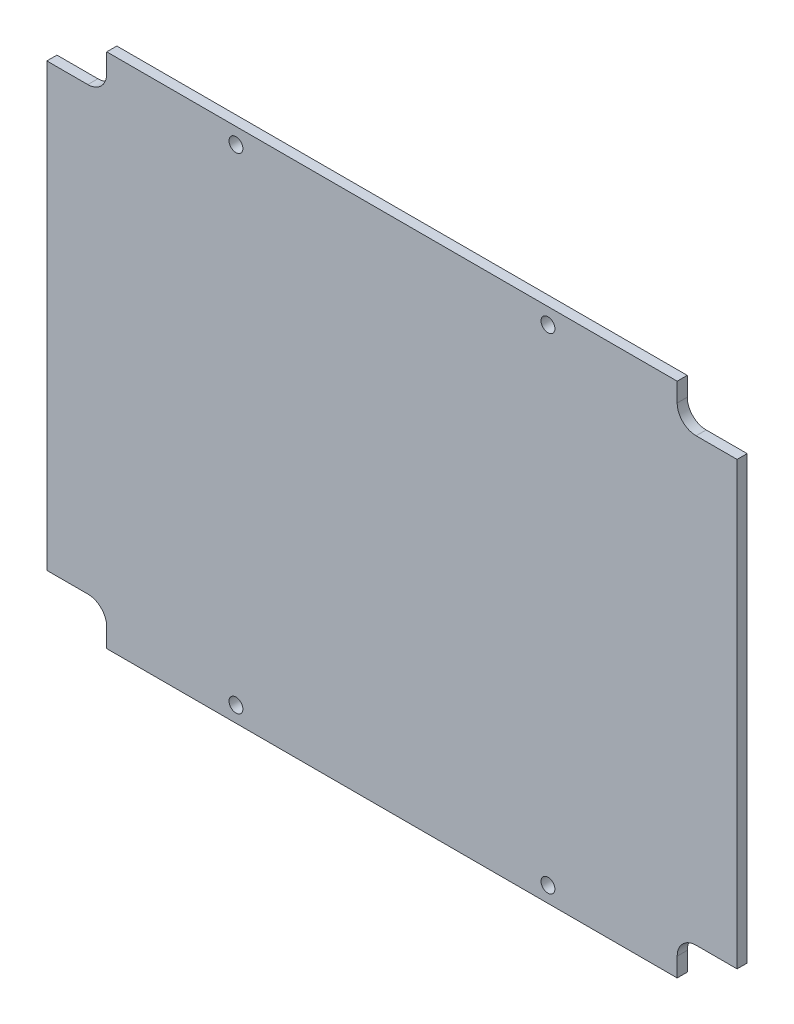
ISO-10303-21;
HEADER;
FILE_DESCRIPTION(('STEP AP214'),'2;1');
FILE_NAME('part.step','',(''),(''),'','','');
FILE_SCHEMA(('AUTOMOTIVE_DESIGN { 1 0 10303 214 1 1 1 1 }'));
ENDSEC;
DATA;
#1=APPLICATION_CONTEXT('core data for automotive mechanical design processes');
#2=APPLICATION_PROTOCOL_DEFINITION('international standard','automotive_design',2000,#1);
#3=PRODUCT_CONTEXT('',#1,'mechanical');
#4=PRODUCT('Part','Part','',(#3));
#5=PRODUCT_RELATED_PRODUCT_CATEGORY('part','',(#4));
#6=PRODUCT_DEFINITION_FORMATION('','',#4);
#7=PRODUCT_DEFINITION_CONTEXT('part definition',#1,'design');
#8=PRODUCT_DEFINITION('design','',#6,#7);
#9=PRODUCT_DEFINITION_SHAPE('','',#8);
#10=(LENGTH_UNIT() NAMED_UNIT(*) SI_UNIT(.MILLI.,.METRE.));
#11=(NAMED_UNIT(*) PLANE_ANGLE_UNIT() SI_UNIT($,.RADIAN.));
#12=(NAMED_UNIT(*) SI_UNIT($,.STERADIAN.) SOLID_ANGLE_UNIT());
#13=UNCERTAINTY_MEASURE_WITH_UNIT(LENGTH_MEASURE(1.E-05),#10,'distance_accuracy_value','');
#14=(GEOMETRIC_REPRESENTATION_CONTEXT(3) GLOBAL_UNCERTAINTY_ASSIGNED_CONTEXT((#13)) GLOBAL_UNIT_ASSIGNED_CONTEXT((#10,
#11,#12)) REPRESENTATION_CONTEXT('',''));
#15=CARTESIAN_POINT('',(0.,0.,0.));
#16=DIRECTION('',(0.,0.,1.));
#17=DIRECTION('',(1.,0.,0.));
#18=AXIS2_PLACEMENT_3D('',#15,#16,#17);
#19=CARTESIAN_POINT('',(-55.493641501856,9.95185693007489,1.6));
#20=DIRECTION('',(0.,0.,1.));
#21=DIRECTION('',(1.,0.,0.));
#22=AXIS2_PLACEMENT_3D('',#19,#20,#21);
#23=PLANE('',#22);
#24=CARTESIAN_POINT('',(24.006358498144,6.45185693007488,1.6));
#25=DIRECTION('',(0.,0.,1.));
#26=DIRECTION('',(1.,0.,0.));
#27=AXIS2_PLACEMENT_3D('',#24,#25,#26);
#28=CIRCLE('',#27,1.1);
#29=CARTESIAN_POINT('',(25.106358498144,6.45185693007488,1.6));
#30=VERTEX_POINT('',#29);
#31=EDGE_CURVE('E518',#30,#30,#28,.T.);
#32=ORIENTED_EDGE('',*,*,#31,.F.);
#33=EDGE_LOOP('',(#32));
#34=FACE_BOUND('',#33,.T.);
#35=CARTESIAN_POINT('',(-25.493641501856,83.4518569300749,1.6));
#36=DIRECTION('',(0.,0.,1.));
#37=DIRECTION('',(1.,0.,0.));
#38=AXIS2_PLACEMENT_3D('',#35,#36,#37);
#39=CIRCLE('',#38,1.1);
#40=CARTESIAN_POINT('',(-24.393641501856,83.4518569300749,1.6));
#41=VERTEX_POINT('',#40);
#42=EDGE_CURVE('E290',#41,#41,#39,.T.);
#43=ORIENTED_EDGE('',*,*,#42,.F.);
#44=EDGE_LOOP('',(#43));
#45=FACE_BOUND('',#44,.T.);
#46=DIRECTION('',(0.,-1.,0.));
#47=VECTOR('',#46,1.);
#48=CARTESIAN_POINT('',(-55.493641501856,79.9518569300749,1.6));
#49=LINE('',#48,#47);
#50=CARTESIAN_POINT('',(-55.493641501856,79.9518569300749,1.6));
#51=VERTEX_POINT('',#50);
#52=CARTESIAN_POINT('',(-55.493641501856,9.95185693007489,1.6));
#53=VERTEX_POINT('',#52);
#54=EDGE_CURVE('E152',#51,#53,#49,.T.);
#55=ORIENTED_EDGE('',*,*,#54,.T.);
#56=DIRECTION('',(1.,0.,0.));
#57=VECTOR('',#56,1.);
#58=CARTESIAN_POINT('',(-55.493641501856,9.95185693007489,1.6));
#59=LINE('',#58,#57);
#60=CARTESIAN_POINT('',(-48.993641501856,9.95185693007488,1.6));
#61=VERTEX_POINT('',#60);
#62=EDGE_CURVE('E143',#53,#61,#59,.T.);
#63=ORIENTED_EDGE('',*,*,#62,.T.);
#64=CARTESIAN_POINT('',(-48.993641501856,6.95185693007488,1.6));
#65=DIRECTION('',(0.,0.,1.));
#66=DIRECTION('',(1.,0.,0.));
#67=AXIS2_PLACEMENT_3D('',#64,#65,#66);
#68=CIRCLE('',#67,3.);
#69=CARTESIAN_POINT('',(-45.993641501856,6.95185693007488,1.6));
#70=VERTEX_POINT('',#69);
#71=EDGE_CURVE('E11',#61,#70,#68,.F.);
#72=ORIENTED_EDGE('',*,*,#71,.T.);
#73=DIRECTION('',(0.,-1.,0.));
#74=VECTOR('',#73,1.);
#75=CARTESIAN_POINT('',(-45.993641501856,9.95185693007488,1.6));
#76=LINE('',#75,#74);
#77=CARTESIAN_POINT('',(-45.993641501856,3.95185693007479,1.6));
#78=VERTEX_POINT('',#77);
#79=EDGE_CURVE('E151',#70,#78,#76,.T.);
#80=ORIENTED_EDGE('',*,*,#79,.T.);
#81=DIRECTION('',(1.,0.,0.));
#82=VECTOR('',#81,1.);
#83=CARTESIAN_POINT('',(-45.993641501856,3.95185693007479,1.6));
#84=LINE('',#83,#82);
#85=CARTESIAN_POINT('',(44.506358498144,3.95185693007488,1.6));
#86=VERTEX_POINT('',#85);
#87=EDGE_CURVE('E297',#78,#86,#84,.T.);
#88=ORIENTED_EDGE('',*,*,#87,.T.);
#89=DIRECTION('',(0.,1.,0.));
#90=VECTOR('',#89,1.);
#91=CARTESIAN_POINT('',(44.506358498144,3.95185693007488,1.6));
#92=LINE('',#91,#90);
#93=CARTESIAN_POINT('',(44.506358498144,6.95185693007488,1.6));
#94=VERTEX_POINT('',#93);
#95=EDGE_CURVE('E254',#86,#94,#92,.T.);
#96=ORIENTED_EDGE('',*,*,#95,.T.);
#97=CARTESIAN_POINT('',(47.506358498144,6.95185693007488,1.6));
#98=DIRECTION('',(0.,0.,1.));
#99=DIRECTION('',(1.,0.,0.));
#100=AXIS2_PLACEMENT_3D('',#97,#98,#99);
#101=CIRCLE('',#100,3.);
#102=CARTESIAN_POINT('',(47.506358498144,9.95185693007488,1.6));
#103=VERTEX_POINT('',#102);
#104=EDGE_CURVE('E194',#94,#103,#101,.F.);
#105=ORIENTED_EDGE('',*,*,#104,.T.);
#106=DIRECTION('',(1.,0.,0.));
#107=VECTOR('',#106,1.);
#108=CARTESIAN_POINT('',(44.506358498144,9.95185693007488,1.6));
#109=LINE('',#108,#107);
#110=CARTESIAN_POINT('',(54.006358498144,9.95185693007488,1.6));
#111=VERTEX_POINT('',#110);
#112=EDGE_CURVE('E299',#103,#111,#109,.T.);
#113=ORIENTED_EDGE('',*,*,#112,.T.);
#114=DIRECTION('',(0.,1.,0.));
#115=VECTOR('',#114,1.);
#116=CARTESIAN_POINT('',(54.006358498144,79.9518569300749,1.6));
#117=LINE('',#116,#115);
#118=CARTESIAN_POINT('',(54.006358498144,79.9518569300749,1.6));
#119=VERTEX_POINT('',#118);
#120=EDGE_CURVE('E304',#111,#119,#117,.T.);
#121=ORIENTED_EDGE('',*,*,#120,.T.);
#122=DIRECTION('',(-1.,0.,0.));
#123=VECTOR('',#122,1.);
#124=CARTESIAN_POINT('',(44.506358498144,79.9518569300749,1.6));
#125=LINE('',#124,#123);
#126=CARTESIAN_POINT('',(47.506358498144,79.9518569300749,1.6));
#127=VERTEX_POINT('',#126);
#128=EDGE_CURVE('E284',#119,#127,#125,.T.);
#129=ORIENTED_EDGE('',*,*,#128,.T.);
#130=CARTESIAN_POINT('',(47.506358498144,82.9518569300749,1.6));
#131=DIRECTION('',(0.,0.,1.));
#132=DIRECTION('',(1.,0.,0.));
#133=AXIS2_PLACEMENT_3D('',#130,#131,#132);
#134=CIRCLE('',#133,3.);
#135=CARTESIAN_POINT('',(44.506358498144,82.9518569300749,1.6));
#136=VERTEX_POINT('',#135);
#137=EDGE_CURVE('E198',#127,#136,#134,.F.);
#138=ORIENTED_EDGE('',*,*,#137,.T.);
#139=DIRECTION('',(0.,1.,0.));
#140=VECTOR('',#139,1.);
#141=CARTESIAN_POINT('',(44.506358498144,85.9518569300749,1.6));
#142=LINE('',#141,#140);
#143=CARTESIAN_POINT('',(44.506358498144,85.9518569300749,1.6));
#144=VERTEX_POINT('',#143);
#145=EDGE_CURVE('E281',#136,#144,#142,.T.);
#146=ORIENTED_EDGE('',*,*,#145,.T.);
#147=DIRECTION('',(-1.,0.,0.));
#148=VECTOR('',#147,1.);
#149=CARTESIAN_POINT('',(-45.993641501856,85.9518569300749,1.6));
#150=LINE('',#149,#148);
#151=CARTESIAN_POINT('',(-45.993641501856,85.9518569300749,1.6));
#152=VERTEX_POINT('',#151);
#153=EDGE_CURVE('E280',#144,#152,#150,.T.);
#154=ORIENTED_EDGE('',*,*,#153,.T.);
#155=DIRECTION('',(0.,-1.,0.));
#156=VECTOR('',#155,1.);
#157=CARTESIAN_POINT('',(-45.993641501856,79.9518569300749,1.6));
#158=LINE('',#157,#156);
#159=CARTESIAN_POINT('',(-45.993641501856,82.9518569300749,1.6));
#160=VERTEX_POINT('',#159);
#161=EDGE_CURVE('E206',#152,#160,#158,.T.);
#162=ORIENTED_EDGE('',*,*,#161,.T.);
#163=CARTESIAN_POINT('',(-48.993641501856,82.9518569300749,1.6));
#164=DIRECTION('',(0.,0.,1.));
#165=DIRECTION('',(1.,0.,0.));
#166=AXIS2_PLACEMENT_3D('',#163,#164,#165);
#167=CIRCLE('',#166,3.);
#168=CARTESIAN_POINT('',(-48.993641501856,79.9518569300749,1.6));
#169=VERTEX_POINT('',#168);
#170=EDGE_CURVE('E202',#160,#169,#167,.F.);
#171=ORIENTED_EDGE('',*,*,#170,.T.);
#172=DIRECTION('',(-1.,0.,0.));
#173=VECTOR('',#172,1.);
#174=CARTESIAN_POINT('',(-55.493641501856,79.9518569300749,1.6));
#175=LINE('',#174,#173);
#176=EDGE_CURVE('E157',#169,#51,#175,.T.);
#177=ORIENTED_EDGE('',*,*,#176,.T.);
#178=EDGE_LOOP('',(#55,#63,#72,#80,#88,#96,#105,#113,#121,#129,#138,#146,#154,#162,#171,#177));
#179=FACE_BOUND('',#178,.T.);
#180=CARTESIAN_POINT('',(24.006358498144,83.4518569300749,1.6));
#181=DIRECTION('',(0.,0.,1.));
#182=DIRECTION('',(1.,0.,0.));
#183=AXIS2_PLACEMENT_3D('',#180,#181,#182);
#184=CIRCLE('',#183,1.1);
#185=CARTESIAN_POINT('',(25.106358498144,83.4518569300749,1.6));
#186=VERTEX_POINT('',#185);
#187=EDGE_CURVE('E531',#186,#186,#184,.T.);
#188=ORIENTED_EDGE('',*,*,#187,.F.);
#189=EDGE_LOOP('',(#188));
#190=FACE_BOUND('',#189,.T.);
#191=CARTESIAN_POINT('',(-25.493641501856,6.45185693007487,1.6));
#192=DIRECTION('',(0.,0.,1.));
#193=DIRECTION('',(1.,0.,0.));
#194=AXIS2_PLACEMENT_3D('',#191,#192,#193);
#195=CIRCLE('',#194,1.1);
#196=CARTESIAN_POINT('',(-24.393641501856,6.45185693007487,1.6));
#197=VERTEX_POINT('',#196);
#198=EDGE_CURVE('E522',#197,#197,#195,.T.);
#199=ORIENTED_EDGE('',*,*,#198,.F.);
#200=EDGE_LOOP('',(#199));
#201=FACE_BOUND('',#200,.T.);
#202=ADVANCED_FACE('F34',(#34,#45,#179,#190,#201),#23,.T.);
#203=CARTESIAN_POINT('',(-55.493641501856,9.95185693007489,0.));
#204=DIRECTION('',(0.,0.,1.));
#205=DIRECTION('',(1.,0.,0.));
#206=AXIS2_PLACEMENT_3D('',#203,#204,#205);
#207=PLANE('',#206);
#208=CARTESIAN_POINT('',(24.006358498144,6.45185693007488,0.));
#209=DIRECTION('',(0.,0.,1.));
#210=DIRECTION('',(1.,0.,0.));
#211=AXIS2_PLACEMENT_3D('',#208,#209,#210);
#212=CIRCLE('',#211,1.1);
#213=CARTESIAN_POINT('',(25.106358498144,6.45185693007488,0.));
#214=VERTEX_POINT('',#213);
#215=EDGE_CURVE('E521',#214,#214,#212,.T.);
#216=ORIENTED_EDGE('',*,*,#215,.T.);
#217=EDGE_LOOP('',(#216));
#218=FACE_BOUND('',#217,.T.);
#219=CARTESIAN_POINT('',(-25.493641501856,83.4518569300749,0.));
#220=DIRECTION('',(0.,0.,1.));
#221=DIRECTION('',(1.,0.,0.));
#222=AXIS2_PLACEMENT_3D('',#219,#220,#221);
#223=CIRCLE('',#222,1.1);
#224=CARTESIAN_POINT('',(-24.393641501856,83.4518569300749,0.));
#225=VERTEX_POINT('',#224);
#226=EDGE_CURVE('E534',#225,#225,#223,.T.);
#227=ORIENTED_EDGE('',*,*,#226,.T.);
#228=EDGE_LOOP('',(#227));
#229=FACE_BOUND('',#228,.T.);
#230=DIRECTION('',(0.,-1.,0.));
#231=VECTOR('',#230,1.);
#232=CARTESIAN_POINT('',(-55.493641501856,79.9518569300749,0.));
#233=LINE('',#232,#231);
#234=CARTESIAN_POINT('',(-55.493641501856,79.9518569300749,0.));
#235=VERTEX_POINT('',#234);
#236=CARTESIAN_POINT('',(-55.493641501856,9.95185693007489,0.));
#237=VERTEX_POINT('',#236);
#238=EDGE_CURVE('E165',#235,#237,#233,.T.);
#239=ORIENTED_EDGE('',*,*,#238,.F.);
#240=DIRECTION('',(-1.,0.,0.));
#241=VECTOR('',#240,1.);
#242=CARTESIAN_POINT('',(-55.493641501856,79.9518569300749,0.));
#243=LINE('',#242,#241);
#244=CARTESIAN_POINT('',(-48.993641501856,79.9518569300749,0.));
#245=VERTEX_POINT('',#244);
#246=EDGE_CURVE('E161',#245,#235,#243,.T.);
#247=ORIENTED_EDGE('',*,*,#246,.F.);
#248=CARTESIAN_POINT('',(-48.993641501856,82.9518569300749,0.));
#249=DIRECTION('',(0.,0.,1.));
#250=DIRECTION('',(1.,0.,0.));
#251=AXIS2_PLACEMENT_3D('',#248,#249,#250);
#252=CIRCLE('',#251,3.);
#253=CARTESIAN_POINT('',(-45.993641501856,82.9518569300749,0.));
#254=VERTEX_POINT('',#253);
#255=EDGE_CURVE('E200',#245,#254,#252,.T.);
#256=ORIENTED_EDGE('',*,*,#255,.T.);
#257=DIRECTION('',(0.,-1.,0.));
#258=VECTOR('',#257,1.);
#259=CARTESIAN_POINT('',(-45.993641501856,79.9518569300749,0.));
#260=LINE('',#259,#258);
#261=CARTESIAN_POINT('',(-45.993641501856,85.9518569300749,0.));
#262=VERTEX_POINT('',#261);
#263=EDGE_CURVE('E221',#262,#254,#260,.T.);
#264=ORIENTED_EDGE('',*,*,#263,.F.);
#265=DIRECTION('',(-1.,0.,0.));
#266=VECTOR('',#265,1.);
#267=CARTESIAN_POINT('',(-45.993641501856,85.9518569300749,0.));
#268=LINE('',#267,#266);
#269=CARTESIAN_POINT('',(44.506358498144,85.9518569300749,0.));
#270=VERTEX_POINT('',#269);
#271=EDGE_CURVE('E227',#270,#262,#268,.T.);
#272=ORIENTED_EDGE('',*,*,#271,.F.);
#273=DIRECTION('',(0.,1.,0.));
#274=VECTOR('',#273,1.);
#275=CARTESIAN_POINT('',(44.506358498144,85.9518569300749,0.));
#276=LINE('',#275,#274);
#277=CARTESIAN_POINT('',(44.506358498144,82.9518569300749,0.));
#278=VERTEX_POINT('',#277);
#279=EDGE_CURVE('E230',#278,#270,#276,.T.);
#280=ORIENTED_EDGE('',*,*,#279,.F.);
#281=CARTESIAN_POINT('',(47.506358498144,82.9518569300749,0.));
#282=DIRECTION('',(0.,0.,1.));
#283=DIRECTION('',(1.,0.,0.));
#284=AXIS2_PLACEMENT_3D('',#281,#282,#283);
#285=CIRCLE('',#284,3.);
#286=CARTESIAN_POINT('',(47.506358498144,79.9518569300749,0.));
#287=VERTEX_POINT('',#286);
#288=EDGE_CURVE('E196',#278,#287,#285,.T.);
#289=ORIENTED_EDGE('',*,*,#288,.T.);
#290=DIRECTION('',(-1.,0.,0.));
#291=VECTOR('',#290,1.);
#292=CARTESIAN_POINT('',(44.506358498144,79.9518569300749,0.));
#293=LINE('',#292,#291);
#294=CARTESIAN_POINT('',(54.006358498144,79.9518569300749,0.));
#295=VERTEX_POINT('',#294);
#296=EDGE_CURVE('E269',#295,#287,#293,.T.);
#297=ORIENTED_EDGE('',*,*,#296,.F.);
#298=DIRECTION('',(0.,1.,0.));
#299=VECTOR('',#298,1.);
#300=CARTESIAN_POINT('',(54.006358498144,79.9518569300749,0.));
#301=LINE('',#300,#299);
#302=CARTESIAN_POINT('',(54.006358498144,9.95185693007488,0.));
#303=VERTEX_POINT('',#302);
#304=EDGE_CURVE('E262',#303,#295,#301,.T.);
#305=ORIENTED_EDGE('',*,*,#304,.F.);
#306=DIRECTION('',(1.,0.,0.));
#307=VECTOR('',#306,1.);
#308=CARTESIAN_POINT('',(44.506358498144,9.95185693007488,0.));
#309=LINE('',#308,#307);
#310=CARTESIAN_POINT('',(47.506358498144,9.95185693007488,0.));
#311=VERTEX_POINT('',#310);
#312=EDGE_CURVE('E260',#311,#303,#309,.T.);
#313=ORIENTED_EDGE('',*,*,#312,.F.);
#314=CARTESIAN_POINT('',(47.506358498144,6.95185693007488,0.));
#315=DIRECTION('',(0.,0.,1.));
#316=DIRECTION('',(1.,0.,0.));
#317=AXIS2_PLACEMENT_3D('',#314,#315,#316);
#318=CIRCLE('',#317,3.);
#319=CARTESIAN_POINT('',(44.506358498144,6.95185693007488,0.));
#320=VERTEX_POINT('',#319);
#321=EDGE_CURVE('E192',#311,#320,#318,.T.);
#322=ORIENTED_EDGE('',*,*,#321,.T.);
#323=DIRECTION('',(0.,1.,0.));
#324=VECTOR('',#323,1.);
#325=CARTESIAN_POINT('',(44.506358498144,3.95185693007488,0.));
#326=LINE('',#325,#324);
#327=CARTESIAN_POINT('',(44.506358498144,3.95185693007488,0.));
#328=VERTEX_POINT('',#327);
#329=EDGE_CURVE('E251',#328,#320,#326,.T.);
#330=ORIENTED_EDGE('',*,*,#329,.F.);
#331=DIRECTION('',(1.,0.,0.));
#332=VECTOR('',#331,1.);
#333=CARTESIAN_POINT('',(-45.993641501856,3.95185693007479,0.));
#334=LINE('',#333,#332);
#335=CARTESIAN_POINT('',(-45.993641501856,3.95185693007479,0.));
#336=VERTEX_POINT('',#335);
#337=EDGE_CURVE('E258',#336,#328,#334,.T.);
#338=ORIENTED_EDGE('',*,*,#337,.F.);
#339=DIRECTION('',(0.,-1.,0.));
#340=VECTOR('',#339,1.);
#341=CARTESIAN_POINT('',(-45.993641501856,9.95185693007488,0.));
#342=LINE('',#341,#340);
#343=CARTESIAN_POINT('',(-45.993641501856,6.95185693007488,0.));
#344=VERTEX_POINT('',#343);
#345=EDGE_CURVE('E264',#344,#336,#342,.T.);
#346=ORIENTED_EDGE('',*,*,#345,.F.);
#347=CARTESIAN_POINT('',(-48.993641501856,6.95185693007488,0.));
#348=DIRECTION('',(0.,0.,1.));
#349=DIRECTION('',(1.,0.,0.));
#350=AXIS2_PLACEMENT_3D('',#347,#348,#349);
#351=CIRCLE('',#350,3.);
#352=CARTESIAN_POINT('',(-48.993641501856,9.95185693007488,0.));
#353=VERTEX_POINT('',#352);
#354=EDGE_CURVE('E42',#344,#353,#351,.T.);
#355=ORIENTED_EDGE('',*,*,#354,.T.);
#356=DIRECTION('',(1.,0.,0.));
#357=VECTOR('',#356,1.);
#358=CARTESIAN_POINT('',(-55.493641501856,9.95185693007489,0.));
#359=LINE('',#358,#357);
#360=EDGE_CURVE('E289',#237,#353,#359,.T.);
#361=ORIENTED_EDGE('',*,*,#360,.F.);
#362=EDGE_LOOP('',(#239,#247,#256,#264,#272,#280,#289,#297,#305,#313,#322,#330,#338,#346,#355,#361));
#363=FACE_BOUND('',#362,.T.);
#364=CARTESIAN_POINT('',(24.006358498144,83.4518569300749,0.));
#365=DIRECTION('',(0.,0.,1.));
#366=DIRECTION('',(1.,0.,0.));
#367=AXIS2_PLACEMENT_3D('',#364,#365,#366);
#368=CIRCLE('',#367,1.1);
#369=CARTESIAN_POINT('',(25.106358498144,83.4518569300749,0.));
#370=VERTEX_POINT('',#369);
#371=EDGE_CURVE('E524',#370,#370,#368,.T.);
#372=ORIENTED_EDGE('',*,*,#371,.T.);
#373=EDGE_LOOP('',(#372));
#374=FACE_BOUND('',#373,.T.);
#375=CARTESIAN_POINT('',(-25.493641501856,6.45185693007487,0.));
#376=DIRECTION('',(0.,0.,1.));
#377=DIRECTION('',(1.,0.,0.));
#378=AXIS2_PLACEMENT_3D('',#375,#376,#377);
#379=CIRCLE('',#378,1.1);
#380=CARTESIAN_POINT('',(-24.393641501856,6.45185693007487,0.));
#381=VERTEX_POINT('',#380);
#382=EDGE_CURVE('E527',#381,#381,#379,.T.);
#383=ORIENTED_EDGE('',*,*,#382,.T.);
#384=EDGE_LOOP('',(#383));
#385=FACE_BOUND('',#384,.T.);
#386=ADVANCED_FACE('F218',(#218,#229,#363,#374,#385),#207,.F.);
#387=CARTESIAN_POINT('',(-55.493641501856,79.9518569300749,1.6));
#388=DIRECTION('',(1.,0.,0.));
#389=DIRECTION('',(0.,0.,-1.));
#390=AXIS2_PLACEMENT_3D('',#387,#388,#389);
#391=PLANE('',#390);
#392=ORIENTED_EDGE('',*,*,#238,.T.);
#393=DIRECTION('',(0.,0.,-1.));
#394=VECTOR('',#393,1.);
#395=CARTESIAN_POINT('',(-55.493641501856,9.95185693007489,1.6));
#396=LINE('',#395,#394);
#397=EDGE_CURVE('E147',#53,#237,#396,.T.);
#398=ORIENTED_EDGE('',*,*,#397,.F.);
#399=ORIENTED_EDGE('',*,*,#54,.F.);
#400=DIRECTION('',(0.,0.,-1.));
#401=VECTOR('',#400,1.);
#402=CARTESIAN_POINT('',(-55.493641501856,79.9518569300749,1.6));
#403=LINE('',#402,#401);
#404=EDGE_CURVE('E213',#51,#235,#403,.T.);
#405=ORIENTED_EDGE('',*,*,#404,.T.);
#406=EDGE_LOOP('',(#392,#398,#399,#405));
#407=FACE_BOUND('',#406,.T.);
#408=ADVANCED_FACE('F163',(#407),#391,.F.);
#409=CARTESIAN_POINT('',(-55.493641501856,9.95185693007489,1.6));
#410=DIRECTION('',(0.,1.,0.));
#411=DIRECTION('',(-1.,0.,0.));
#412=AXIS2_PLACEMENT_3D('',#409,#410,#411);
#413=PLANE('',#412);
#414=ORIENTED_EDGE('',*,*,#360,.T.);
#415=DIRECTION('',(0.,0.,-1.));
#416=VECTOR('',#415,1.);
#417=CARTESIAN_POINT('',(-48.993641501856,9.95185693007488,1.6));
#418=LINE('',#417,#416);
#419=EDGE_CURVE('E49',#353,#61,#418,.F.);
#420=ORIENTED_EDGE('',*,*,#419,.T.);
#421=ORIENTED_EDGE('',*,*,#62,.F.);
#422=ORIENTED_EDGE('',*,*,#397,.T.);
#423=EDGE_LOOP('',(#414,#420,#421,#422));
#424=FACE_BOUND('',#423,.T.);
#425=ADVANCED_FACE('F145',(#424),#413,.F.);
#426=CARTESIAN_POINT('',(-45.993641501856,9.95185693007488,1.6));
#427=DIRECTION('',(1.,0.,0.));
#428=DIRECTION('',(0.,0.,-1.));
#429=AXIS2_PLACEMENT_3D('',#426,#427,#428);
#430=PLANE('',#429);
#431=ORIENTED_EDGE('',*,*,#79,.F.);
#432=DIRECTION('',(0.,0.,-1.));
#433=VECTOR('',#432,1.);
#434=CARTESIAN_POINT('',(-45.993641501856,6.95185693007488,0.));
#435=LINE('',#434,#433);
#436=EDGE_CURVE('E188',#70,#344,#435,.T.);
#437=ORIENTED_EDGE('',*,*,#436,.T.);
#438=ORIENTED_EDGE('',*,*,#345,.T.);
#439=DIRECTION('',(0.,0.,-1.));
#440=VECTOR('',#439,1.);
#441=CARTESIAN_POINT('',(-45.993641501856,3.95185693007479,1.6));
#442=LINE('',#441,#440);
#443=EDGE_CURVE('E167',#78,#336,#442,.T.);
#444=ORIENTED_EDGE('',*,*,#443,.F.);
#445=EDGE_LOOP('',(#431,#437,#438,#444));
#446=FACE_BOUND('',#445,.T.);
#447=ADVANCED_FACE('F294',(#446),#430,.F.);
#448=CARTESIAN_POINT('',(-45.993641501856,3.95185693007479,1.6));
#449=DIRECTION('',(0.,1.,0.));
#450=DIRECTION('',(-1.,0.,0.));
#451=AXIS2_PLACEMENT_3D('',#448,#449,#450);
#452=PLANE('',#451);
#453=ORIENTED_EDGE('',*,*,#337,.T.);
#454=DIRECTION('',(0.,0.,-1.));
#455=VECTOR('',#454,1.);
#456=CARTESIAN_POINT('',(44.506358498144,3.95185693007488,1.6));
#457=LINE('',#456,#455);
#458=EDGE_CURVE('E173',#86,#328,#457,.T.);
#459=ORIENTED_EDGE('',*,*,#458,.F.);
#460=ORIENTED_EDGE('',*,*,#87,.F.);
#461=ORIENTED_EDGE('',*,*,#443,.T.);
#462=EDGE_LOOP('',(#453,#459,#460,#461));
#463=FACE_BOUND('',#462,.T.);
#464=ADVANCED_FACE('F296',(#463),#452,.F.);
#465=CARTESIAN_POINT('',(44.506358498144,3.95185693007488,1.6));
#466=DIRECTION('',(-1.,0.,0.));
#467=DIRECTION('',(0.,0.,1.));
#468=AXIS2_PLACEMENT_3D('',#465,#466,#467);
#469=PLANE('',#468);
#470=ORIENTED_EDGE('',*,*,#329,.T.);
#471=DIRECTION('',(0.,0.,-1.));
#472=VECTOR('',#471,1.);
#473=CARTESIAN_POINT('',(44.506358498144,6.95185693007488,1.6));
#474=LINE('',#473,#472);
#475=EDGE_CURVE('E170',#320,#94,#474,.F.);
#476=ORIENTED_EDGE('',*,*,#475,.T.);
#477=ORIENTED_EDGE('',*,*,#95,.F.);
#478=ORIENTED_EDGE('',*,*,#458,.T.);
#479=EDGE_LOOP('',(#470,#476,#477,#478));
#480=FACE_BOUND('',#479,.T.);
#481=ADVANCED_FACE('F250',(#480),#469,.F.);
#482=CARTESIAN_POINT('',(44.506358498144,9.95185693007488,1.6));
#483=DIRECTION('',(0.,1.,0.));
#484=DIRECTION('',(0.,0.,1.));
#485=AXIS2_PLACEMENT_3D('',#482,#483,#484);
#486=PLANE('',#485);
#487=ORIENTED_EDGE('',*,*,#112,.F.);
#488=DIRECTION('',(0.,0.,-1.));
#489=VECTOR('',#488,1.);
#490=CARTESIAN_POINT('',(47.506358498144,9.95185693007488,0.));
#491=LINE('',#490,#489);
#492=EDGE_CURVE('E166',#103,#311,#491,.T.);
#493=ORIENTED_EDGE('',*,*,#492,.T.);
#494=ORIENTED_EDGE('',*,*,#312,.T.);
#495=DIRECTION('',(0.,0.,-1.));
#496=VECTOR('',#495,1.);
#497=CARTESIAN_POINT('',(54.006358498144,9.95185693007488,1.6));
#498=LINE('',#497,#496);
#499=EDGE_CURVE('E242',#111,#303,#498,.T.);
#500=ORIENTED_EDGE('',*,*,#499,.F.);
#501=EDGE_LOOP('',(#487,#493,#494,#500));
#502=FACE_BOUND('',#501,.T.);
#503=ADVANCED_FACE('F322',(#502),#486,.F.);
#504=CARTESIAN_POINT('',(54.006358498144,79.9518569300749,1.6));
#505=DIRECTION('',(-1.,0.,0.));
#506=DIRECTION('',(0.,-1.,0.));
#507=AXIS2_PLACEMENT_3D('',#504,#505,#506);
#508=PLANE('',#507);
#509=ORIENTED_EDGE('',*,*,#304,.T.);
#510=DIRECTION('',(0.,0.,-1.));
#511=VECTOR('',#510,1.);
#512=CARTESIAN_POINT('',(54.006358498144,79.9518569300749,1.6));
#513=LINE('',#512,#511);
#514=EDGE_CURVE('E239',#119,#295,#513,.T.);
#515=ORIENTED_EDGE('',*,*,#514,.F.);
#516=ORIENTED_EDGE('',*,*,#120,.F.);
#517=ORIENTED_EDGE('',*,*,#499,.T.);
#518=EDGE_LOOP('',(#509,#515,#516,#517));
#519=FACE_BOUND('',#518,.T.);
#520=ADVANCED_FACE('F318',(#519),#508,.F.);
#521=CARTESIAN_POINT('',(44.506358498144,79.9518569300749,1.6));
#522=DIRECTION('',(0.,-1.,0.));
#523=DIRECTION('',(0.,0.,-1.));
#524=AXIS2_PLACEMENT_3D('',#521,#522,#523);
#525=PLANE('',#524);
#526=ORIENTED_EDGE('',*,*,#296,.T.);
#527=DIRECTION('',(0.,0.,-1.));
#528=VECTOR('',#527,1.);
#529=CARTESIAN_POINT('',(47.506358498144,79.9518569300749,1.6));
#530=LINE('',#529,#528);
#531=EDGE_CURVE('E181',#287,#127,#530,.F.);
#532=ORIENTED_EDGE('',*,*,#531,.T.);
#533=ORIENTED_EDGE('',*,*,#128,.F.);
#534=ORIENTED_EDGE('',*,*,#514,.T.);
#535=EDGE_LOOP('',(#526,#532,#533,#534));
#536=FACE_BOUND('',#535,.T.);
#537=ADVANCED_FACE('F316',(#536),#525,.F.);
#538=CARTESIAN_POINT('',(44.506358498144,85.9518569300749,1.6));
#539=DIRECTION('',(-1.,0.,0.));
#540=DIRECTION('',(0.,-1.,0.));
#541=AXIS2_PLACEMENT_3D('',#538,#539,#540);
#542=PLANE('',#541);
#543=ORIENTED_EDGE('',*,*,#145,.F.);
#544=DIRECTION('',(0.,0.,-1.));
#545=VECTOR('',#544,1.);
#546=CARTESIAN_POINT('',(44.506358498144,82.9518569300749,0.));
#547=LINE('',#546,#545);
#548=EDGE_CURVE('E178',#136,#278,#547,.T.);
#549=ORIENTED_EDGE('',*,*,#548,.T.);
#550=ORIENTED_EDGE('',*,*,#279,.T.);
#551=DIRECTION('',(0.,0.,-1.));
#552=VECTOR('',#551,1.);
#553=CARTESIAN_POINT('',(44.506358498144,85.9518569300749,1.6));
#554=LINE('',#553,#552);
#555=EDGE_CURVE('E236',#144,#270,#554,.T.);
#556=ORIENTED_EDGE('',*,*,#555,.F.);
#557=EDGE_LOOP('',(#543,#549,#550,#556));
#558=FACE_BOUND('',#557,.T.);
#559=ADVANCED_FACE('F275',(#558),#542,.F.);
#560=CARTESIAN_POINT('',(-45.993641501856,85.9518569300749,1.6));
#561=DIRECTION('',(0.,-1.,0.));
#562=DIRECTION('',(0.,0.,-1.));
#563=AXIS2_PLACEMENT_3D('',#560,#561,#562);
#564=PLANE('',#563);
#565=ORIENTED_EDGE('',*,*,#271,.T.);
#566=DIRECTION('',(0.,0.,-1.));
#567=VECTOR('',#566,1.);
#568=CARTESIAN_POINT('',(-45.993641501856,85.9518569300749,1.6));
#569=LINE('',#568,#567);
#570=EDGE_CURVE('E226',#152,#262,#569,.T.);
#571=ORIENTED_EDGE('',*,*,#570,.F.);
#572=ORIENTED_EDGE('',*,*,#153,.F.);
#573=ORIENTED_EDGE('',*,*,#555,.T.);
#574=EDGE_LOOP('',(#565,#571,#572,#573));
#575=FACE_BOUND('',#574,.T.);
#576=ADVANCED_FACE('F279',(#575),#564,.F.);
#577=CARTESIAN_POINT('',(-45.993641501856,79.9518569300749,1.6));
#578=DIRECTION('',(1.,0.,0.));
#579=DIRECTION('',(0.,0.,-1.));
#580=AXIS2_PLACEMENT_3D('',#577,#578,#579);
#581=PLANE('',#580);
#582=ORIENTED_EDGE('',*,*,#263,.T.);
#583=DIRECTION('',(0.,0.,-1.));
#584=VECTOR('',#583,1.);
#585=CARTESIAN_POINT('',(-45.993641501856,82.9518569300749,1.6));
#586=LINE('',#585,#584);
#587=EDGE_CURVE('E186',#254,#160,#586,.F.);
#588=ORIENTED_EDGE('',*,*,#587,.T.);
#589=ORIENTED_EDGE('',*,*,#161,.F.);
#590=ORIENTED_EDGE('',*,*,#570,.T.);
#591=EDGE_LOOP('',(#582,#588,#589,#590));
#592=FACE_BOUND('',#591,.T.);
#593=ADVANCED_FACE('F224',(#592),#581,.F.);
#594=CARTESIAN_POINT('',(-55.493641501856,79.9518569300749,1.6));
#595=DIRECTION('',(0.,-1.,0.));
#596=DIRECTION('',(0.,0.,-1.));
#597=AXIS2_PLACEMENT_3D('',#594,#595,#596);
#598=PLANE('',#597);
#599=ORIENTED_EDGE('',*,*,#176,.F.);
#600=DIRECTION('',(0.,0.,-1.));
#601=VECTOR('',#600,1.);
#602=CARTESIAN_POINT('',(-48.993641501856,79.9518569300749,0.));
#603=LINE('',#602,#601);
#604=EDGE_CURVE('E183',#169,#245,#603,.T.);
#605=ORIENTED_EDGE('',*,*,#604,.T.);
#606=ORIENTED_EDGE('',*,*,#246,.T.);
#607=ORIENTED_EDGE('',*,*,#404,.F.);
#608=EDGE_LOOP('',(#599,#605,#606,#607));
#609=FACE_BOUND('',#608,.T.);
#610=ADVANCED_FACE('F211',(#609),#598,.F.);
#611=CARTESIAN_POINT('',(-25.493641501856,83.4518569300749,1.6));
#612=DIRECTION('',(0.,0.,-1.));
#613=DIRECTION('',(-1.,0.,0.));
#614=AXIS2_PLACEMENT_3D('',#611,#612,#613);
#615=CYLINDRICAL_SURFACE('',#614,1.1);
#616=ORIENTED_EDGE('',*,*,#42,.T.);
#617=EDGE_LOOP('',(#616));
#618=FACE_BOUND('',#617,.T.);
#619=ORIENTED_EDGE('',*,*,#226,.F.);
#620=EDGE_LOOP('',(#619));
#621=FACE_BOUND('',#620,.T.);
#622=ADVANCED_FACE('F350',(#618,#621),#615,.F.);
#623=CARTESIAN_POINT('',(24.006358498144,83.4518569300749,1.6));
#624=DIRECTION('',(0.,0.,-1.));
#625=DIRECTION('',(-1.,0.,0.));
#626=AXIS2_PLACEMENT_3D('',#623,#624,#625);
#627=CYLINDRICAL_SURFACE('',#626,1.1);
#628=ORIENTED_EDGE('',*,*,#187,.T.);
#629=EDGE_LOOP('',(#628));
#630=FACE_BOUND('',#629,.T.);
#631=ORIENTED_EDGE('',*,*,#371,.F.);
#632=EDGE_LOOP('',(#631));
#633=FACE_BOUND('',#632,.T.);
#634=ADVANCED_FACE('F429',(#630,#633),#627,.F.);
#635=CARTESIAN_POINT('',(24.006358498144,6.45185693007488,1.6));
#636=DIRECTION('',(0.,0.,-1.));
#637=DIRECTION('',(-1.,0.,0.));
#638=AXIS2_PLACEMENT_3D('',#635,#636,#637);
#639=CYLINDRICAL_SURFACE('',#638,1.1);
#640=ORIENTED_EDGE('',*,*,#31,.T.);
#641=EDGE_LOOP('',(#640));
#642=FACE_BOUND('',#641,.T.);
#643=ORIENTED_EDGE('',*,*,#215,.F.);
#644=EDGE_LOOP('',(#643));
#645=FACE_BOUND('',#644,.T.);
#646=ADVANCED_FACE('F335',(#642,#645),#639,.F.);
#647=CARTESIAN_POINT('',(-25.493641501856,6.45185693007487,1.6));
#648=DIRECTION('',(0.,0.,-1.));
#649=DIRECTION('',(-1.,0.,0.));
#650=AXIS2_PLACEMENT_3D('',#647,#648,#649);
#651=CYLINDRICAL_SURFACE('',#650,1.1);
#652=ORIENTED_EDGE('',*,*,#198,.T.);
#653=EDGE_LOOP('',(#652));
#654=FACE_BOUND('',#653,.T.);
#655=ORIENTED_EDGE('',*,*,#382,.F.);
#656=EDGE_LOOP('',(#655));
#657=FACE_BOUND('',#656,.T.);
#658=ADVANCED_FACE('F328',(#654,#657),#651,.F.);
#659=CARTESIAN_POINT('',(47.506358498144,6.95185693007488,1.6));
#660=DIRECTION('',(0.,0.,1.));
#661=DIRECTION('',(1.,0.,0.));
#662=AXIS2_PLACEMENT_3D('',#659,#660,#661);
#663=CYLINDRICAL_SURFACE('',#662,3.);
#664=ORIENTED_EDGE('',*,*,#104,.F.);
#665=ORIENTED_EDGE('',*,*,#475,.F.);
#666=ORIENTED_EDGE('',*,*,#321,.F.);
#667=ORIENTED_EDGE('',*,*,#492,.F.);
#668=EDGE_LOOP('',(#664,#665,#666,#667));
#669=FACE_BOUND('',#668,.T.);
#670=ADVANCED_FACE('F326',(#669),#663,.F.);
#671=CARTESIAN_POINT('',(47.506358498144,82.9518569300749,1.6));
#672=DIRECTION('',(0.,0.,1.));
#673=DIRECTION('',(1.,0.,0.));
#674=AXIS2_PLACEMENT_3D('',#671,#672,#673);
#675=CYLINDRICAL_SURFACE('',#674,3.);
#676=ORIENTED_EDGE('',*,*,#137,.F.);
#677=ORIENTED_EDGE('',*,*,#531,.F.);
#678=ORIENTED_EDGE('',*,*,#288,.F.);
#679=ORIENTED_EDGE('',*,*,#548,.F.);
#680=EDGE_LOOP('',(#676,#677,#678,#679));
#681=FACE_BOUND('',#680,.T.);
#682=ADVANCED_FACE('F313',(#681),#675,.F.);
#683=CARTESIAN_POINT('',(-48.993641501856,82.9518569300749,1.6));
#684=DIRECTION('',(0.,0.,1.));
#685=DIRECTION('',(1.,0.,0.));
#686=AXIS2_PLACEMENT_3D('',#683,#684,#685);
#687=CYLINDRICAL_SURFACE('',#686,3.);
#688=ORIENTED_EDGE('',*,*,#170,.F.);
#689=ORIENTED_EDGE('',*,*,#587,.F.);
#690=ORIENTED_EDGE('',*,*,#255,.F.);
#691=ORIENTED_EDGE('',*,*,#604,.F.);
#692=EDGE_LOOP('',(#688,#689,#690,#691));
#693=FACE_BOUND('',#692,.T.);
#694=ADVANCED_FACE('F215',(#693),#687,.F.);
#695=CARTESIAN_POINT('',(-48.993641501856,6.95185693007488,1.6));
#696=DIRECTION('',(0.,0.,1.));
#697=DIRECTION('',(1.,0.,0.));
#698=AXIS2_PLACEMENT_3D('',#695,#696,#697);
#699=CYLINDRICAL_SURFACE('',#698,3.);
#700=ORIENTED_EDGE('',*,*,#71,.F.);
#701=ORIENTED_EDGE('',*,*,#419,.F.);
#702=ORIENTED_EDGE('',*,*,#354,.F.);
#703=ORIENTED_EDGE('',*,*,#436,.F.);
#704=EDGE_LOOP('',(#700,#701,#702,#703));
#705=FACE_BOUND('',#704,.T.);
#706=ADVANCED_FACE('F36',(#705),#699,.F.);
#707=CLOSED_SHELL('',(#202,#386,#408,#425,#447,#464,#481,#503,#520,#537,#559,#576,#593,#610,
#622,#634,#646,#658,#670,#682,#694,#706));
#708=MANIFOLD_SOLID_BREP('B2',#707);
#709=ADVANCED_BREP_SHAPE_REPRESENTATION('',(#18,#708),#14);
#710=SHAPE_DEFINITION_REPRESENTATION(#9,#709);
ENDSEC;
END-ISO-10303-21;
